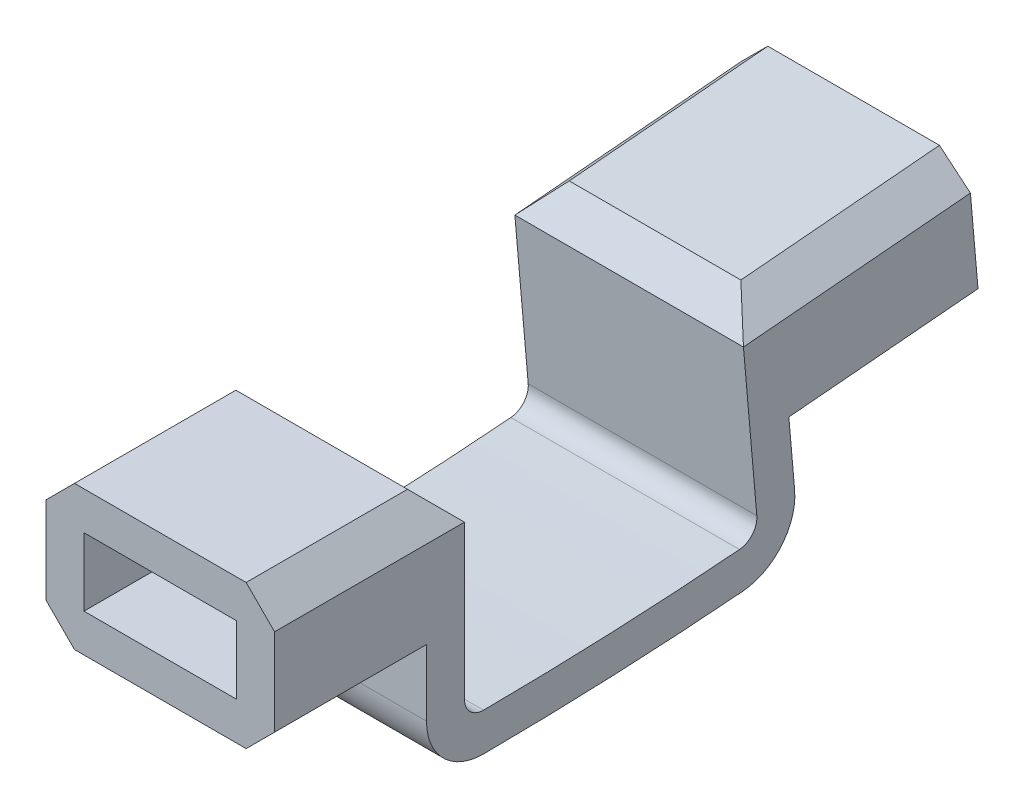
ISO-10303-21;
HEADER;
FILE_DESCRIPTION(('STEP AP214'),'2;1');
FILE_NAME('part.step','',(''),(''),'','','');
FILE_SCHEMA(('AUTOMOTIVE_DESIGN { 1 0 10303 214 1 1 1 1 }'));
ENDSEC;
DATA;
#1=APPLICATION_CONTEXT('core data for automotive mechanical design processes');
#2=APPLICATION_PROTOCOL_DEFINITION('international standard','automotive_design',2000,#1);
#3=PRODUCT_CONTEXT('',#1,'mechanical');
#4=PRODUCT('Part','Part','',(#3));
#5=PRODUCT_RELATED_PRODUCT_CATEGORY('part','',(#4));
#6=PRODUCT_DEFINITION_FORMATION('','',#4);
#7=PRODUCT_DEFINITION_CONTEXT('part definition',#1,'design');
#8=PRODUCT_DEFINITION('design','',#6,#7);
#9=PRODUCT_DEFINITION_SHAPE('','',#8);
#10=(LENGTH_UNIT() NAMED_UNIT(*) SI_UNIT(.MILLI.,.METRE.));
#11=(NAMED_UNIT(*) PLANE_ANGLE_UNIT() SI_UNIT($,.RADIAN.));
#12=(NAMED_UNIT(*) SI_UNIT($,.STERADIAN.) SOLID_ANGLE_UNIT());
#13=UNCERTAINTY_MEASURE_WITH_UNIT(LENGTH_MEASURE(1.E-05),#10,'distance_accuracy_value','');
#14=(GEOMETRIC_REPRESENTATION_CONTEXT(3) GLOBAL_UNCERTAINTY_ASSIGNED_CONTEXT((#13)) GLOBAL_UNIT_ASSIGNED_CONTEXT((#10,
#11,#12)) REPRESENTATION_CONTEXT('',''));
#15=CARTESIAN_POINT('',(0.,0.,0.));
#16=DIRECTION('',(0.,0.,1.));
#17=DIRECTION('',(1.,0.,0.));
#18=AXIS2_PLACEMENT_3D('',#15,#16,#17);
#19=CARTESIAN_POINT('',(0.,0.,8.));
#20=DIRECTION('',(0.,0.,1.));
#21=DIRECTION('',(1.,0.,0.));
#22=AXIS2_PLACEMENT_3D('',#19,#20,#21);
#23=PLANE('',#22);
#24=DIRECTION('',(0.,-1.,0.));
#25=VECTOR('',#24,1.);
#26=CARTESIAN_POINT('',(-6.02,3.79,8.));
#27=LINE('',#26,#25);
#28=CARTESIAN_POINT('',(-6.02,2.29,8.));
#29=VERTEX_POINT('',#28);
#30=CARTESIAN_POINT('',(-6.02,-2.28999999999999,8.));
#31=VERTEX_POINT('',#30);
#32=EDGE_CURVE('E424',#29,#31,#27,.T.);
#33=ORIENTED_EDGE('',*,*,#32,.T.);
#34=DIRECTION('',(-0.707106781186546,0.707106781186549,0.));
#35=VECTOR('',#34,1.);
#36=CARTESIAN_POINT('',(-4.15500000000001,-4.15499999999999,8.));
#37=LINE('',#36,#35);
#38=CARTESIAN_POINT('',(-4.52,-3.79,8.));
#39=VERTEX_POINT('',#38);
#40=EDGE_CURVE('E481',#31,#39,#37,.F.);
#41=ORIENTED_EDGE('',*,*,#40,.T.);
#42=DIRECTION('',(1.,0.,0.));
#43=VECTOR('',#42,1.);
#44=CARTESIAN_POINT('',(-6.02,-3.79,8.));
#45=LINE('',#44,#43);
#46=CARTESIAN_POINT('',(4.52,-3.79,8.));
#47=VERTEX_POINT('',#46);
#48=EDGE_CURVE('E427',#39,#47,#45,.T.);
#49=ORIENTED_EDGE('',*,*,#48,.T.);
#50=DIRECTION('',(-0.707106781186548,-0.707106781186548,0.));
#51=VECTOR('',#50,1.);
#52=CARTESIAN_POINT('',(4.155,-4.155,8.));
#53=LINE('',#52,#51);
#54=CARTESIAN_POINT('',(6.02,-2.29,8.));
#55=VERTEX_POINT('',#54);
#56=EDGE_CURVE('E479',#47,#55,#53,.F.);
#57=ORIENTED_EDGE('',*,*,#56,.T.);
#58=DIRECTION('',(0.,1.,0.));
#59=VECTOR('',#58,1.);
#60=CARTESIAN_POINT('',(6.02,3.79,8.));
#61=LINE('',#60,#59);
#62=CARTESIAN_POINT('',(6.02,2.29,8.));
#63=VERTEX_POINT('',#62);
#64=EDGE_CURVE('E418',#55,#63,#61,.T.);
#65=ORIENTED_EDGE('',*,*,#64,.T.);
#66=DIRECTION('',(0.707106781186549,-0.707106781186546,0.));
#67=VECTOR('',#66,1.);
#68=CARTESIAN_POINT('',(4.15499999999999,4.155,8.));
#69=LINE('',#68,#67);
#70=CARTESIAN_POINT('',(4.51999999999999,3.79,8.));
#71=VERTEX_POINT('',#70);
#72=EDGE_CURVE('E477',#63,#71,#69,.F.);
#73=ORIENTED_EDGE('',*,*,#72,.T.);
#74=DIRECTION('',(-1.,0.,0.));
#75=VECTOR('',#74,1.);
#76=CARTESIAN_POINT('',(-6.02,3.79,8.));
#77=LINE('',#76,#75);
#78=CARTESIAN_POINT('',(-4.51999999999999,3.79,8.));
#79=VERTEX_POINT('',#78);
#80=EDGE_CURVE('E421',#71,#79,#77,.T.);
#81=ORIENTED_EDGE('',*,*,#80,.T.);
#82=DIRECTION('',(0.707106781186549,0.707106781186546,0.));
#83=VECTOR('',#82,1.);
#84=CARTESIAN_POINT('',(-4.15499999999998,4.155,8.));
#85=LINE('',#84,#83);
#86=EDGE_CURVE('E475',#79,#29,#85,.F.);
#87=ORIENTED_EDGE('',*,*,#86,.T.);
#88=EDGE_LOOP('',(#33,#41,#49,#57,#65,#73,#81,#87));
#89=FACE_BOUND('',#88,.T.);
#90=DIRECTION('',(1.,0.,0.));
#91=VECTOR('',#90,1.);
#92=CARTESIAN_POINT('',(4.02,-1.79,8.));
#93=LINE('',#92,#91);
#94=CARTESIAN_POINT('',(-4.02,-1.79,8.));
#95=VERTEX_POINT('',#94);
#96=CARTESIAN_POINT('',(4.02,-1.79,8.));
#97=VERTEX_POINT('',#96);
#98=EDGE_CURVE('E391',#95,#97,#93,.T.);
#99=ORIENTED_EDGE('',*,*,#98,.F.);
#100=DIRECTION('',(0.,-1.,0.));
#101=VECTOR('',#100,1.);
#102=CARTESIAN_POINT('',(-4.02,-1.79,8.));
#103=LINE('',#102,#101);
#104=CARTESIAN_POINT('',(-4.02,1.79,8.));
#105=VERTEX_POINT('',#104);
#106=EDGE_CURVE('E389',#105,#95,#103,.T.);
#107=ORIENTED_EDGE('',*,*,#106,.F.);
#108=DIRECTION('',(-1.,0.,0.));
#109=VECTOR('',#108,1.);
#110=CARTESIAN_POINT('',(4.02,1.79,8.));
#111=LINE('',#110,#109);
#112=CARTESIAN_POINT('',(4.02,1.79,8.));
#113=VERTEX_POINT('',#112);
#114=EDGE_CURVE('E397',#113,#105,#111,.T.);
#115=ORIENTED_EDGE('',*,*,#114,.F.);
#116=DIRECTION('',(0.,1.,0.));
#117=VECTOR('',#116,1.);
#118=CARTESIAN_POINT('',(4.02,-1.79,8.));
#119=LINE('',#118,#117);
#120=EDGE_CURVE('E394',#97,#113,#119,.T.);
#121=ORIENTED_EDGE('',*,*,#120,.F.);
#122=EDGE_LOOP('',(#99,#107,#115,#121));
#123=FACE_BOUND('',#122,.T.);
#124=ADVANCED_FACE('F45',(#89,#123),#23,.T.);
#125=CARTESIAN_POINT('',(6.02,3.79,8.));
#126=DIRECTION('',(-1.,0.,0.));
#127=DIRECTION('',(0.,0.,1.));
#128=AXIS2_PLACEMENT_3D('',#125,#126,#127);
#129=PLANE('',#128);
#130=DIRECTION('',(0.,0.996194698091746,0.0871557427476521));
#131=VECTOR('',#130,1.);
#132=CARTESIAN_POINT('',(6.02,-4.94057397638758,-19.390234428028));
#133=LINE('',#132,#131);
#134=CARTESIAN_POINT('',(6.02,-4.94057397638758,-19.390234428028));
#135=VERTEX_POINT('',#134);
#136=CARTESIAN_POINT('',(6.02,-1.45671186892928,-19.0854359883379));
#137=VERTEX_POINT('',#136);
#138=EDGE_CURVE('E315',#135,#137,#133,.T.);
#139=ORIENTED_EDGE('',*,*,#138,.T.);
#140=DIRECTION('',(0.,0.0871557427476518,-0.996194698091746));
#141=VECTOR('',#140,1.);
#142=CARTESIAN_POINT('',(6.02,-0.585154441452762,-29.0473829692553));
#143=LINE('',#142,#141);
#144=CARTESIAN_POINT('',(6.02,-0.585154441452762,-29.0473829692553));
#145=VERTEX_POINT('',#144);
#146=EDGE_CURVE('E442',#137,#145,#143,.T.);
#147=ORIENTED_EDGE('',*,*,#146,.T.);
#148=DIRECTION('',(0.,0.996194698091746,0.0871557427476517));
#149=VECTOR('',#148,1.);
#150=CARTESIAN_POINT('',(6.02,5.47170932294505,-28.5174760533496));
#151=LINE('',#150,#149);
#152=CARTESIAN_POINT('',(6.02,3.97741727580741,-28.6482096674711));
#153=VERTEX_POINT('',#152);
#154=EDGE_CURVE('E303',#145,#153,#151,.T.);
#155=ORIENTED_EDGE('',*,*,#154,.T.);
#156=DIRECTION('',(0.,-0.0871557427476518,0.996194698091746));
#157=VECTOR('',#156,1.);
#158=CARTESIAN_POINT('',(6.02,2.93154836283559,-16.6938732903701));
#159=LINE('',#158,#157);
#160=CARTESIAN_POINT('',(6.02,2.93154836283559,-16.6938732903701));
#161=VERTEX_POINT('',#160);
#162=EDGE_CURVE('E440',#153,#161,#159,.T.);
#163=ORIENTED_EDGE('',*,*,#162,.T.);
#164=DIRECTION('',(0.,0.996194698091746,0.087155742747652));
#165=VECTOR('',#164,1.);
#166=CARTESIAN_POINT('',(6.02,-5.11488546188288,-17.3978450318445));
#167=LINE('',#166,#165);
#168=CARTESIAN_POINT('',(6.02,-5.11488546188288,-17.3978450318445));
#169=VERTEX_POINT('',#168);
#170=EDGE_CURVE('E342',#169,#161,#167,.T.);
#171=ORIENTED_EDGE('',*,*,#170,.F.);
#172=CARTESIAN_POINT('',(6.02,-5.20204120463053,-16.4016503337527));
#173=DIRECTION('',(1.,0.,0.));
#174=DIRECTION('',(0.,0.,-1.));
#175=AXIS2_PLACEMENT_3D('',#172,#173,#174);
#176=CIRCLE('',#175,1.);
#177=CARTESIAN_POINT('',(6.02,-6.19871326071766,-16.4831660538013));
#178=VERTEX_POINT('',#177);
#179=EDGE_CURVE('E345',#178,#169,#176,.T.);
#180=ORIENTED_EDGE('',*,*,#179,.F.);
#181=CARTESIAN_POINT('',(6.02,170.883288601951,-2.));
#182=DIRECTION('',(1.,0.,0.));
#183=DIRECTION('',(0.,0.,-1.));
#184=AXIS2_PLACEMENT_3D('',#181,#182,#183);
#185=CIRCLE('',#184,177.673288601951);
#186=CARTESIAN_POINT('',(6.02,-6.78715387586887,-3.00566016520049));
#187=VERTEX_POINT('',#186);
#188=EDGE_CURVE('E348',#187,#178,#185,.T.);
#189=ORIENTED_EDGE('',*,*,#188,.F.);
#190=CARTESIAN_POINT('',(6.02,-5.78716989473221,-3.));
#191=DIRECTION('',(1.,0.,0.));
#192=DIRECTION('',(0.,0.,-1.));
#193=AXIS2_PLACEMENT_3D('',#190,#191,#192);
#194=CIRCLE('',#193,1.00000000000001);
#195=CARTESIAN_POINT('',(6.02,-5.78716989473221,-2.));
#196=VERTEX_POINT('',#195);
#197=EDGE_CURVE('E351',#196,#187,#194,.T.);
#198=ORIENTED_EDGE('',*,*,#197,.F.);
#199=DIRECTION('',(0.,-1.,0.));
#200=VECTOR('',#199,1.);
#201=CARTESIAN_POINT('',(6.02,0.,-2.));
#202=LINE('',#201,#200);
#203=CARTESIAN_POINT('',(6.02,2.29,-2.));
#204=VERTEX_POINT('',#203);
#205=EDGE_CURVE('E340',#204,#196,#202,.T.);
#206=ORIENTED_EDGE('',*,*,#205,.F.);
#207=DIRECTION('',(0.,0.,1.));
#208=VECTOR('',#207,1.);
#209=CARTESIAN_POINT('',(6.02,2.29,8.));
#210=LINE('',#209,#208);
#211=EDGE_CURVE('E435',#204,#63,#210,.T.);
#212=ORIENTED_EDGE('',*,*,#211,.T.);
#213=ORIENTED_EDGE('',*,*,#64,.F.);
#214=DIRECTION('',(0.,0.,-1.));
#215=VECTOR('',#214,1.);
#216=CARTESIAN_POINT('',(6.02,-2.29,8.));
#217=LINE('',#216,#215);
#218=CARTESIAN_POINT('',(6.02,-2.29,0.));
#219=VERTEX_POINT('',#218);
#220=EDGE_CURVE('E437',#55,#219,#217,.T.);
#221=ORIENTED_EDGE('',*,*,#220,.T.);
#222=DIRECTION('',(0.,-1.,0.));
#223=VECTOR('',#222,1.);
#224=CARTESIAN_POINT('',(6.02,-3.79,0.));
#225=LINE('',#224,#223);
#226=CARTESIAN_POINT('',(6.02,-5.78716989473221,0.));
#227=VERTEX_POINT('',#226);
#228=EDGE_CURVE('E354',#219,#227,#225,.T.);
#229=ORIENTED_EDGE('',*,*,#228,.T.);
#230=CARTESIAN_POINT('',(6.02,-5.78716989473221,-3.));
#231=DIRECTION('',(1.,0.,0.));
#232=DIRECTION('',(0.,-1.,0.));
#233=AXIS2_PLACEMENT_3D('',#230,#231,#232);
#234=CIRCLE('',#233,3.00000000000001);
#235=CARTESIAN_POINT('',(6.02,-8.78712183814216,-3.01698049560145));
#236=VERTEX_POINT('',#235);
#237=EDGE_CURVE('E357',#227,#236,#234,.T.);
#238=ORIENTED_EDGE('',*,*,#237,.T.);
#239=CARTESIAN_POINT('',(6.02,170.883288601951,-2.));
#240=DIRECTION('',(1.,0.,0.));
#241=DIRECTION('',(0.,-1.,0.));
#242=AXIS2_PLACEMENT_3D('',#239,#240,#241);
#243=CIRCLE('',#242,179.673288601951);
#244=CARTESIAN_POINT('',(6.02,-8.19205737289195,-16.6461974938985));
#245=VERTEX_POINT('',#244);
#246=EDGE_CURVE('E360',#236,#245,#243,.T.);
#247=ORIENTED_EDGE('',*,*,#246,.T.);
#248=CARTESIAN_POINT('',(6.02,-5.20204120463053,-16.4016503337527));
#249=DIRECTION('',(1.,0.,0.));
#250=DIRECTION('',(0.,-1.,0.));
#251=AXIS2_PLACEMENT_3D('',#248,#249,#250);
#252=CIRCLE('',#251,3.);
#253=EDGE_CURVE('E363',#245,#135,#252,.T.);
#254=ORIENTED_EDGE('',*,*,#253,.T.);
#255=EDGE_LOOP('',(#139,#147,#155,#163,#171,#180,#189,#198,#206,#212,#213,#221,#229,#238,#247,#254));
#256=FACE_BOUND('',#255,.T.);
#257=ADVANCED_FACE('F519',(#256),#129,.F.);
#258=CARTESIAN_POINT('',(-6.02,3.79,8.));
#259=DIRECTION('',(0.,-1.,0.));
#260=DIRECTION('',(0.,0.,-1.));
#261=AXIS2_PLACEMENT_3D('',#258,#259,#260);
#262=PLANE('',#261);
#263=ORIENTED_EDGE('',*,*,#80,.F.);
#264=DIRECTION('',(0.,0.,-1.));
#265=VECTOR('',#264,1.);
#266=CARTESIAN_POINT('',(4.51999999999999,3.79,8.));
#267=LINE('',#266,#265);
#268=CARTESIAN_POINT('',(4.51999999999999,3.79,-0.499999999999992));
#269=VERTEX_POINT('',#268);
#270=EDGE_CURVE('E486',#71,#269,#267,.T.);
#271=ORIENTED_EDGE('',*,*,#270,.T.);
#272=DIRECTION('',(-1.,0.,0.));
#273=VECTOR('',#272,1.);
#274=CARTESIAN_POINT('',(-6.02,3.79,-0.499999999999992));
#275=LINE('',#274,#273);
#276=CARTESIAN_POINT('',(-4.51999999999999,3.79,-0.499999999999992));
#277=VERTEX_POINT('',#276);
#278=EDGE_CURVE('E70',#269,#277,#275,.T.);
#279=ORIENTED_EDGE('',*,*,#278,.T.);
#280=DIRECTION('',(0.,0.,1.));
#281=VECTOR('',#280,1.);
#282=CARTESIAN_POINT('',(-4.51999999999999,3.79,8.));
#283=LINE('',#282,#281);
#284=EDGE_CURVE('E483',#277,#79,#283,.T.);
#285=ORIENTED_EDGE('',*,*,#284,.T.);
#286=EDGE_LOOP('',(#263,#271,#279,#285));
#287=FACE_BOUND('',#286,.T.);
#288=ADVANCED_FACE('F510',(#287),#262,.F.);
#289=CARTESIAN_POINT('',(-6.02,3.79,8.));
#290=DIRECTION('',(1.,0.,0.));
#291=DIRECTION('',(0.,0.,-1.));
#292=AXIS2_PLACEMENT_3D('',#289,#290,#291);
#293=PLANE('',#292);
#294=DIRECTION('',(0.,-0.996194698091746,-0.0871557427476517));
#295=VECTOR('',#294,1.);
#296=CARTESIAN_POINT('',(-6.02,5.47170932294505,-28.5174760533496));
#297=LINE('',#296,#295);
#298=CARTESIAN_POINT('',(-6.02,3.97741727580741,-28.6482096674711));
#299=VERTEX_POINT('',#298);
#300=CARTESIAN_POINT('',(-6.02,-0.585154441452759,-29.0473829692553));
#301=VERTEX_POINT('',#300);
#302=EDGE_CURVE('E309',#299,#301,#297,.T.);
#303=ORIENTED_EDGE('',*,*,#302,.T.);
#304=DIRECTION('',(0.,-0.0871557427476518,0.996194698091746));
#305=VECTOR('',#304,1.);
#306=CARTESIAN_POINT('',(-6.02,-1.45671186892928,-19.0854359883379));
#307=LINE('',#306,#305);
#308=CARTESIAN_POINT('',(-6.02,-1.45671186892928,-19.0854359883379));
#309=VERTEX_POINT('',#308);
#310=EDGE_CURVE('E459',#301,#309,#307,.T.);
#311=ORIENTED_EDGE('',*,*,#310,.T.);
#312=DIRECTION('',(0.,-0.996194698091746,-0.087155742747652));
#313=VECTOR('',#312,1.);
#314=CARTESIAN_POINT('',(-6.02,-4.94057397638758,-19.390234428028));
#315=LINE('',#314,#313);
#316=CARTESIAN_POINT('',(-6.02,-4.94057397638758,-19.390234428028));
#317=VERTEX_POINT('',#316);
#318=EDGE_CURVE('E338',#309,#317,#315,.T.);
#319=ORIENTED_EDGE('',*,*,#318,.T.);
#320=CARTESIAN_POINT('',(-6.02,-5.20204120463053,-16.4016503337527));
#321=DIRECTION('',(1.,0.,0.));
#322=DIRECTION('',(0.,0.,-1.));
#323=AXIS2_PLACEMENT_3D('',#320,#321,#322);
#324=CIRCLE('',#323,3.);
#325=CARTESIAN_POINT('',(-6.02,-8.19205737289194,-16.6461974938985));
#326=VERTEX_POINT('',#325);
#327=EDGE_CURVE('E336',#317,#326,#324,.F.);
#328=ORIENTED_EDGE('',*,*,#327,.T.);
#329=CARTESIAN_POINT('',(-6.02,170.883288601951,-2.));
#330=DIRECTION('',(1.,0.,0.));
#331=DIRECTION('',(0.,0.,-1.));
#332=AXIS2_PLACEMENT_3D('',#329,#330,#331);
#333=CIRCLE('',#332,179.673288601951);
#334=CARTESIAN_POINT('',(-6.02,-8.78712183814217,-3.01698049560145));
#335=VERTEX_POINT('',#334);
#336=EDGE_CURVE('E334',#326,#335,#333,.F.);
#337=ORIENTED_EDGE('',*,*,#336,.T.);
#338=CARTESIAN_POINT('',(-6.02,-5.78716989473221,-3.));
#339=DIRECTION('',(1.,0.,0.));
#340=DIRECTION('',(0.,0.,-1.));
#341=AXIS2_PLACEMENT_3D('',#338,#339,#340);
#342=CIRCLE('',#341,3.00000000000001);
#343=CARTESIAN_POINT('',(-6.02,-5.78716989473221,0.));
#344=VERTEX_POINT('',#343);
#345=EDGE_CURVE('E332',#335,#344,#342,.F.);
#346=ORIENTED_EDGE('',*,*,#345,.T.);
#347=DIRECTION('',(0.,1.,0.));
#348=VECTOR('',#347,1.);
#349=CARTESIAN_POINT('',(-6.02,-3.79,0.));
#350=LINE('',#349,#348);
#351=CARTESIAN_POINT('',(-6.02,-2.28999999999999,0.));
#352=VERTEX_POINT('',#351);
#353=EDGE_CURVE('E330',#344,#352,#350,.T.);
#354=ORIENTED_EDGE('',*,*,#353,.T.);
#355=DIRECTION('',(0.,0.,1.));
#356=VECTOR('',#355,1.);
#357=CARTESIAN_POINT('',(-6.02,-2.28999999999999,8.));
#358=LINE('',#357,#356);
#359=EDGE_CURVE('E454',#352,#31,#358,.T.);
#360=ORIENTED_EDGE('',*,*,#359,.T.);
#361=ORIENTED_EDGE('',*,*,#32,.F.);
#362=DIRECTION('',(0.,0.,-1.));
#363=VECTOR('',#362,1.);
#364=CARTESIAN_POINT('',(-6.02,2.29,8.));
#365=LINE('',#364,#363);
#366=CARTESIAN_POINT('',(-6.02,2.29,-2.));
#367=VERTEX_POINT('',#366);
#368=EDGE_CURVE('E452',#29,#367,#365,.T.);
#369=ORIENTED_EDGE('',*,*,#368,.T.);
#370=DIRECTION('',(0.,-1.,0.));
#371=VECTOR('',#370,1.);
#372=CARTESIAN_POINT('',(-6.02,0.,-2.));
#373=LINE('',#372,#371);
#374=CARTESIAN_POINT('',(-6.02,-5.78716989473221,-1.99999999999999));
#375=VERTEX_POINT('',#374);
#376=EDGE_CURVE('E386',#367,#375,#373,.T.);
#377=ORIENTED_EDGE('',*,*,#376,.T.);
#378=CARTESIAN_POINT('',(-6.02,-5.78716989473221,-3.));
#379=DIRECTION('',(1.,0.,0.));
#380=DIRECTION('',(0.,0.,-1.));
#381=AXIS2_PLACEMENT_3D('',#378,#379,#380);
#382=CIRCLE('',#381,1.00000000000001);
#383=CARTESIAN_POINT('',(-6.02,-6.78715387586887,-3.00566016520049));
#384=VERTEX_POINT('',#383);
#385=EDGE_CURVE('E327',#384,#375,#382,.F.);
#386=ORIENTED_EDGE('',*,*,#385,.F.);
#387=CARTESIAN_POINT('',(-6.02,170.883288601951,-2.));
#388=DIRECTION('',(1.,0.,0.));
#389=DIRECTION('',(0.,0.,-1.));
#390=AXIS2_PLACEMENT_3D('',#387,#388,#389);
#391=CIRCLE('',#390,177.673288601951);
#392=CARTESIAN_POINT('',(-6.02,-6.19871326071767,-16.4831660538013));
#393=VERTEX_POINT('',#392);
#394=EDGE_CURVE('E324',#393,#384,#391,.F.);
#395=ORIENTED_EDGE('',*,*,#394,.F.);
#396=CARTESIAN_POINT('',(-6.02,-5.20204120463053,-16.4016503337527));
#397=DIRECTION('',(1.,0.,0.));
#398=DIRECTION('',(0.,0.,-1.));
#399=AXIS2_PLACEMENT_3D('',#396,#397,#398);
#400=CIRCLE('',#399,1.);
#401=CARTESIAN_POINT('',(-6.02,-5.11488546188288,-17.3978450318445));
#402=VERTEX_POINT('',#401);
#403=EDGE_CURVE('E320',#402,#393,#400,.F.);
#404=ORIENTED_EDGE('',*,*,#403,.F.);
#405=DIRECTION('',(0.,-0.996194698091746,-0.087155742747652));
#406=VECTOR('',#405,1.);
#407=CARTESIAN_POINT('',(-6.02,-5.11488546188288,-17.3978450318445));
#408=LINE('',#407,#406);
#409=CARTESIAN_POINT('',(-6.02,2.93154836283559,-16.6938732903701));
#410=VERTEX_POINT('',#409);
#411=EDGE_CURVE('E318',#410,#402,#408,.T.);
#412=ORIENTED_EDGE('',*,*,#411,.F.);
#413=DIRECTION('',(0.,0.0871557427476518,-0.996194698091746));
#414=VECTOR('',#413,1.);
#415=CARTESIAN_POINT('',(-6.02,3.97741727580741,-28.6482096674711));
#416=LINE('',#415,#414);
#417=EDGE_CURVE('E456',#410,#299,#416,.T.);
#418=ORIENTED_EDGE('',*,*,#417,.T.);
#419=EDGE_LOOP('',(#303,#311,#319,#328,#337,#346,#354,#360,#361,#369,#377,#386,#395,#404,#412,#418));
#420=FACE_BOUND('',#419,.T.);
#421=ADVANCED_FACE('F531',(#420),#293,.F.);
#422=CARTESIAN_POINT('',(-6.02,-3.79,8.));
#423=DIRECTION('',(0.,1.,0.));
#424=DIRECTION('',(0.,0.,1.));
#425=AXIS2_PLACEMENT_3D('',#422,#423,#424);
#426=PLANE('',#425);
#427=ORIENTED_EDGE('',*,*,#48,.F.);
#428=DIRECTION('',(0.,0.,-1.));
#429=VECTOR('',#428,1.);
#430=CARTESIAN_POINT('',(-4.52,-3.79,8.));
#431=LINE('',#430,#429);
#432=CARTESIAN_POINT('',(-4.52,-3.79,0.));
#433=VERTEX_POINT('',#432);
#434=EDGE_CURVE('E472',#39,#433,#431,.T.);
#435=ORIENTED_EDGE('',*,*,#434,.T.);
#436=DIRECTION('',(1.,0.,0.));
#437=VECTOR('',#436,1.);
#438=CARTESIAN_POINT('',(-26.28042618021,-3.79,0.));
#439=LINE('',#438,#437);
#440=CARTESIAN_POINT('',(4.52,-3.79,0.));
#441=VERTEX_POINT('',#440);
#442=EDGE_CURVE('E374',#433,#441,#439,.T.);
#443=ORIENTED_EDGE('',*,*,#442,.T.);
#444=DIRECTION('',(0.,0.,1.));
#445=VECTOR('',#444,1.);
#446=CARTESIAN_POINT('',(4.52,-3.79,8.));
#447=LINE('',#446,#445);
#448=EDGE_CURVE('E470',#441,#47,#447,.T.);
#449=ORIENTED_EDGE('',*,*,#448,.T.);
#450=EDGE_LOOP('',(#427,#435,#443,#449));
#451=FACE_BOUND('',#450,.T.);
#452=ADVANCED_FACE('F542',(#451),#426,.F.);
#453=CARTESIAN_POINT('',(-4.02,-1.79,8.));
#454=DIRECTION('',(1.,0.,0.));
#455=DIRECTION('',(0.,0.,-1.));
#456=AXIS2_PLACEMENT_3D('',#453,#454,#455);
#457=PLANE('',#456);
#458=DIRECTION('',(0.,-1.,0.));
#459=VECTOR('',#458,1.);
#460=CARTESIAN_POINT('',(-4.02,-1.79,0.));
#461=LINE('',#460,#459);
#462=CARTESIAN_POINT('',(-4.02,1.79,0.));
#463=VERTEX_POINT('',#462);
#464=CARTESIAN_POINT('',(-4.02,-1.79,0.));
#465=VERTEX_POINT('',#464);
#466=EDGE_CURVE('E388',#463,#465,#461,.T.);
#467=ORIENTED_EDGE('',*,*,#466,.F.);
#468=DIRECTION('',(0.,0.,-1.));
#469=VECTOR('',#468,1.);
#470=CARTESIAN_POINT('',(-4.02,1.79,8.));
#471=LINE('',#470,#469);
#472=EDGE_CURVE('E399',#105,#463,#471,.T.);
#473=ORIENTED_EDGE('',*,*,#472,.F.);
#474=ORIENTED_EDGE('',*,*,#106,.T.);
#475=DIRECTION('',(0.,0.,-1.));
#476=VECTOR('',#475,1.);
#477=CARTESIAN_POINT('',(-4.02,-1.79,8.));
#478=LINE('',#477,#476);
#479=EDGE_CURVE('E415',#95,#465,#478,.T.);
#480=ORIENTED_EDGE('',*,*,#479,.T.);
#481=EDGE_LOOP('',(#467,#473,#474,#480));
#482=FACE_BOUND('',#481,.T.);
#483=ADVANCED_FACE('F632',(#482),#457,.T.);
#484=CARTESIAN_POINT('',(4.02,-1.79,8.));
#485=DIRECTION('',(0.,1.,0.));
#486=DIRECTION('',(0.,0.,1.));
#487=AXIS2_PLACEMENT_3D('',#484,#485,#486);
#488=PLANE('',#487);
#489=DIRECTION('',(1.,0.,0.));
#490=VECTOR('',#489,1.);
#491=CARTESIAN_POINT('',(4.02,-1.79,0.));
#492=LINE('',#491,#490);
#493=CARTESIAN_POINT('',(4.02,-1.79,0.));
#494=VERTEX_POINT('',#493);
#495=EDGE_CURVE('E402',#465,#494,#492,.T.);
#496=ORIENTED_EDGE('',*,*,#495,.F.);
#497=ORIENTED_EDGE('',*,*,#479,.F.);
#498=ORIENTED_EDGE('',*,*,#98,.T.);
#499=DIRECTION('',(0.,0.,-1.));
#500=VECTOR('',#499,1.);
#501=CARTESIAN_POINT('',(4.02,-1.79,8.));
#502=LINE('',#501,#500);
#503=EDGE_CURVE('E413',#97,#494,#502,.T.);
#504=ORIENTED_EDGE('',*,*,#503,.T.);
#505=EDGE_LOOP('',(#496,#497,#498,#504));
#506=FACE_BOUND('',#505,.T.);
#507=ADVANCED_FACE('F929',(#506),#488,.T.);
#508=CARTESIAN_POINT('',(4.02,-1.79,8.));
#509=DIRECTION('',(-1.,0.,0.));
#510=DIRECTION('',(0.,0.,1.));
#511=AXIS2_PLACEMENT_3D('',#508,#509,#510);
#512=PLANE('',#511);
#513=DIRECTION('',(0.,1.,0.));
#514=VECTOR('',#513,1.);
#515=CARTESIAN_POINT('',(4.02,-1.79,0.));
#516=LINE('',#515,#514);
#517=CARTESIAN_POINT('',(4.02,1.79,0.));
#518=VERTEX_POINT('',#517);
#519=EDGE_CURVE('E405',#494,#518,#516,.T.);
#520=ORIENTED_EDGE('',*,*,#519,.F.);
#521=ORIENTED_EDGE('',*,*,#503,.F.);
#522=ORIENTED_EDGE('',*,*,#120,.T.);
#523=DIRECTION('',(0.,0.,-1.));
#524=VECTOR('',#523,1.);
#525=CARTESIAN_POINT('',(4.02,1.79,8.));
#526=LINE('',#525,#524);
#527=EDGE_CURVE('E411',#113,#518,#526,.T.);
#528=ORIENTED_EDGE('',*,*,#527,.T.);
#529=EDGE_LOOP('',(#520,#521,#522,#528));
#530=FACE_BOUND('',#529,.T.);
#531=ADVANCED_FACE('F920',(#530),#512,.T.);
#532=CARTESIAN_POINT('',(4.02,1.79,8.));
#533=DIRECTION('',(0.,-1.,0.));
#534=DIRECTION('',(0.,0.,-1.));
#535=AXIS2_PLACEMENT_3D('',#532,#533,#534);
#536=PLANE('',#535);
#537=DIRECTION('',(-1.,0.,0.));
#538=VECTOR('',#537,1.);
#539=CARTESIAN_POINT('',(4.02,1.79,0.));
#540=LINE('',#539,#538);
#541=EDGE_CURVE('E392',#518,#463,#540,.T.);
#542=ORIENTED_EDGE('',*,*,#541,.F.);
#543=ORIENTED_EDGE('',*,*,#527,.F.);
#544=ORIENTED_EDGE('',*,*,#114,.T.);
#545=ORIENTED_EDGE('',*,*,#472,.T.);
#546=EDGE_LOOP('',(#542,#543,#544,#545));
#547=FACE_BOUND('',#546,.T.);
#548=ADVANCED_FACE('F911',(#547),#536,.T.);
#549=CARTESIAN_POINT('',(0.,0.,0.));
#550=DIRECTION('',(0.,0.,1.));
#551=DIRECTION('',(1.,0.,0.));
#552=AXIS2_PLACEMENT_3D('',#549,#550,#551);
#553=PLANE('',#552);
#554=ORIENTED_EDGE('',*,*,#541,.T.);
#555=ORIENTED_EDGE('',*,*,#466,.T.);
#556=ORIENTED_EDGE('',*,*,#495,.T.);
#557=ORIENTED_EDGE('',*,*,#519,.T.);
#558=EDGE_LOOP('',(#554,#555,#556,#557));
#559=FACE_BOUND('',#558,.T.);
#560=ADVANCED_FACE('F776',(#559),#553,.T.);
#561=CARTESIAN_POINT('',(0.,0.,-2.));
#562=DIRECTION('',(0.,0.,1.));
#563=DIRECTION('',(1.,0.,0.));
#564=AXIS2_PLACEMENT_3D('',#561,#562,#563);
#565=PLANE('',#564);
#566=ORIENTED_EDGE('',*,*,#376,.F.);
#567=DIRECTION('',(1.,0.,0.));
#568=VECTOR('',#567,1.);
#569=CARTESIAN_POINT('',(0.,2.29,-2.));
#570=LINE('',#569,#568);
#571=EDGE_CURVE('E488',#367,#204,#570,.T.);
#572=ORIENTED_EDGE('',*,*,#571,.T.);
#573=ORIENTED_EDGE('',*,*,#205,.T.);
#574=DIRECTION('',(1.,0.,0.));
#575=VECTOR('',#574,1.);
#576=CARTESIAN_POINT('',(-26.28042618021,-5.78716989473221,-2.));
#577=LINE('',#576,#575);
#578=EDGE_CURVE('E377',#375,#196,#577,.T.);
#579=ORIENTED_EDGE('',*,*,#578,.F.);
#580=EDGE_LOOP('',(#566,#572,#573,#579));
#581=FACE_BOUND('',#580,.T.);
#582=ADVANCED_FACE('F526',(#581),#565,.F.);
#583=CARTESIAN_POINT('',(-26.28042618021,-5.11488546188288,-17.3978450318445));
#584=DIRECTION('',(0.,0.087155742747652,-0.996194698091746));
#585=DIRECTION('',(0.,0.996194698091746,0.087155742747652));
#586=AXIS2_PLACEMENT_3D('',#583,#584,#585);
#587=PLANE('',#586);
#588=ORIENTED_EDGE('',*,*,#170,.T.);
#589=DIRECTION('',(-1.,0.,0.));
#590=VECTOR('',#589,1.);
#591=CARTESIAN_POINT('',(-6.02,2.93154836283558,-16.6938732903701));
#592=LINE('',#591,#590);
#593=EDGE_CURVE('E468',#161,#410,#592,.T.);
#594=ORIENTED_EDGE('',*,*,#593,.T.);
#595=ORIENTED_EDGE('',*,*,#411,.T.);
#596=DIRECTION('',(1.,0.,0.));
#597=VECTOR('',#596,1.);
#598=CARTESIAN_POINT('',(-26.28042618021,-5.11488546188288,-17.3978450318445));
#599=LINE('',#598,#597);
#600=EDGE_CURVE('E366',#402,#169,#599,.T.);
#601=ORIENTED_EDGE('',*,*,#600,.T.);
#602=EDGE_LOOP('',(#588,#594,#595,#601));
#603=FACE_BOUND('',#602,.T.);
#604=ADVANCED_FACE('F607',(#603),#587,.F.);
#605=CARTESIAN_POINT('',(-26.28042618021,-5.20204120463053,-16.4016503337527));
#606=DIRECTION('',(1.,0.,0.));
#607=DIRECTION('',(0.,0.,-1.));
#608=AXIS2_PLACEMENT_3D('',#605,#606,#607);
#609=CYLINDRICAL_SURFACE('',#608,1.);
#610=ORIENTED_EDGE('',*,*,#600,.F.);
#611=ORIENTED_EDGE('',*,*,#403,.T.);
#612=DIRECTION('',(1.,0.,0.));
#613=VECTOR('',#612,1.);
#614=CARTESIAN_POINT('',(-26.28042618021,-6.19871326071766,-16.4831660538013));
#615=LINE('',#614,#613);
#616=EDGE_CURVE('E382',#393,#178,#615,.T.);
#617=ORIENTED_EDGE('',*,*,#616,.T.);
#618=ORIENTED_EDGE('',*,*,#179,.T.);
#619=EDGE_LOOP('',(#610,#611,#617,#618));
#620=FACE_BOUND('',#619,.T.);
#621=ADVANCED_FACE('F612',(#620),#609,.F.);
#622=CARTESIAN_POINT('',(-26.28042618021,170.883288601951,-2.));
#623=DIRECTION('',(1.,0.,0.));
#624=DIRECTION('',(0.,0.,-1.));
#625=AXIS2_PLACEMENT_3D('',#622,#623,#624);
#626=CYLINDRICAL_SURFACE('',#625,177.673288601951);
#627=ORIENTED_EDGE('',*,*,#616,.F.);
#628=ORIENTED_EDGE('',*,*,#394,.T.);
#629=DIRECTION('',(1.,0.,0.));
#630=VECTOR('',#629,1.);
#631=CARTESIAN_POINT('',(-26.28042618021,-6.78715387586887,-3.00566016520049));
#632=LINE('',#631,#630);
#633=EDGE_CURVE('E380',#384,#187,#632,.T.);
#634=ORIENTED_EDGE('',*,*,#633,.T.);
#635=ORIENTED_EDGE('',*,*,#188,.T.);
#636=EDGE_LOOP('',(#627,#628,#634,#635));
#637=FACE_BOUND('',#636,.T.);
#638=ADVANCED_FACE('F614',(#637),#626,.F.);
#639=CARTESIAN_POINT('',(-26.28042618021,-5.78716989473221,-3.));
#640=DIRECTION('',(1.,0.,0.));
#641=DIRECTION('',(0.,0.,-1.));
#642=AXIS2_PLACEMENT_3D('',#639,#640,#641);
#643=CYLINDRICAL_SURFACE('',#642,1.00000000000001);
#644=ORIENTED_EDGE('',*,*,#633,.F.);
#645=ORIENTED_EDGE('',*,*,#385,.T.);
#646=ORIENTED_EDGE('',*,*,#578,.T.);
#647=ORIENTED_EDGE('',*,*,#197,.T.);
#648=EDGE_LOOP('',(#644,#645,#646,#647));
#649=FACE_BOUND('',#648,.T.);
#650=ADVANCED_FACE('F529',(#649),#643,.F.);
#651=CARTESIAN_POINT('',(-26.28042618021,-3.79,0.));
#652=DIRECTION('',(0.,0.,1.));
#653=DIRECTION('',(1.,0.,0.));
#654=AXIS2_PLACEMENT_3D('',#651,#652,#653);
#655=PLANE('',#654);
#656=ORIENTED_EDGE('',*,*,#353,.F.);
#657=DIRECTION('',(1.,0.,0.));
#658=VECTOR('',#657,1.);
#659=CARTESIAN_POINT('',(-26.28042618021,-5.78716989473221,0.));
#660=LINE('',#659,#658);
#661=EDGE_CURVE('E372',#344,#227,#660,.T.);
#662=ORIENTED_EDGE('',*,*,#661,.T.);
#663=ORIENTED_EDGE('',*,*,#228,.F.);
#664=DIRECTION('',(0.707106781186548,0.707106781186548,0.));
#665=VECTOR('',#664,1.);
#666=CARTESIAN_POINT('',(6.02,-2.29,0.));
#667=LINE('',#666,#665);
#668=EDGE_CURVE('E11',#219,#441,#667,.F.);
#669=ORIENTED_EDGE('',*,*,#668,.T.);
#670=ORIENTED_EDGE('',*,*,#442,.F.);
#671=DIRECTION('',(0.707106781186546,-0.707106781186549,0.));
#672=VECTOR('',#671,1.);
#673=CARTESIAN_POINT('',(-4.52,-3.79,0.));
#674=LINE('',#673,#672);
#675=EDGE_CURVE('E55',#433,#352,#674,.F.);
#676=ORIENTED_EDGE('',*,*,#675,.T.);
#677=EDGE_LOOP('',(#656,#662,#663,#669,#670,#676));
#678=FACE_BOUND('',#677,.T.);
#679=ADVANCED_FACE('F546',(#678),#655,.T.);
#680=CARTESIAN_POINT('',(-26.28042618021,-5.78716989473221,-3.));
#681=DIRECTION('',(1.,0.,0.));
#682=DIRECTION('',(0.,0.,-1.));
#683=AXIS2_PLACEMENT_3D('',#680,#681,#682);
#684=CYLINDRICAL_SURFACE('',#683,3.00000000000001);
#685=ORIENTED_EDGE('',*,*,#345,.F.);
#686=DIRECTION('',(1.,0.,0.));
#687=VECTOR('',#686,1.);
#688=CARTESIAN_POINT('',(-26.28042618021,-8.78712183814216,-3.01698049560145));
#689=LINE('',#688,#687);
#690=EDGE_CURVE('E370',#335,#236,#689,.T.);
#691=ORIENTED_EDGE('',*,*,#690,.T.);
#692=ORIENTED_EDGE('',*,*,#237,.F.);
#693=ORIENTED_EDGE('',*,*,#661,.F.);
#694=EDGE_LOOP('',(#685,#691,#692,#693));
#695=FACE_BOUND('',#694,.T.);
#696=ADVANCED_FACE('F557',(#695),#684,.T.);
#697=CARTESIAN_POINT('',(-26.28042618021,170.883288601951,-2.));
#698=DIRECTION('',(1.,0.,0.));
#699=DIRECTION('',(0.,0.,-1.));
#700=AXIS2_PLACEMENT_3D('',#697,#698,#699);
#701=CYLINDRICAL_SURFACE('',#700,179.673288601951);
#702=ORIENTED_EDGE('',*,*,#336,.F.);
#703=DIRECTION('',(1.,0.,0.));
#704=VECTOR('',#703,1.);
#705=CARTESIAN_POINT('',(-26.28042618021,-8.19205737289195,-16.6461974938985));
#706=LINE('',#705,#704);
#707=EDGE_CURVE('E368',#326,#245,#706,.T.);
#708=ORIENTED_EDGE('',*,*,#707,.T.);
#709=ORIENTED_EDGE('',*,*,#246,.F.);
#710=ORIENTED_EDGE('',*,*,#690,.F.);
#711=EDGE_LOOP('',(#702,#708,#709,#710));
#712=FACE_BOUND('',#711,.T.);
#713=ADVANCED_FACE('F561',(#712),#701,.T.);
#714=CARTESIAN_POINT('',(-26.28042618021,-5.20204120463053,-16.4016503337527));
#715=DIRECTION('',(1.,0.,0.));
#716=DIRECTION('',(0.,0.,-1.));
#717=AXIS2_PLACEMENT_3D('',#714,#715,#716);
#718=CYLINDRICAL_SURFACE('',#717,3.);
#719=ORIENTED_EDGE('',*,*,#327,.F.);
#720=DIRECTION('',(1.,0.,0.));
#721=VECTOR('',#720,1.);
#722=CARTESIAN_POINT('',(-26.28042618021,-4.94057397638758,-19.390234428028));
#723=LINE('',#722,#721);
#724=EDGE_CURVE('E321',#317,#135,#723,.T.);
#725=ORIENTED_EDGE('',*,*,#724,.T.);
#726=ORIENTED_EDGE('',*,*,#253,.F.);
#727=ORIENTED_EDGE('',*,*,#707,.F.);
#728=EDGE_LOOP('',(#719,#725,#726,#727));
#729=FACE_BOUND('',#728,.T.);
#730=ADVANCED_FACE('F565',(#729),#718,.T.);
#731=CARTESIAN_POINT('',(-26.28042618021,-4.94057397638758,-19.390234428028));
#732=DIRECTION('',(0.,0.087155742747652,-0.996194698091746));
#733=DIRECTION('',(0.,0.996194698091746,0.087155742747652));
#734=AXIS2_PLACEMENT_3D('',#731,#732,#733);
#735=PLANE('',#734);
#736=ORIENTED_EDGE('',*,*,#318,.F.);
#737=DIRECTION('',(0.707106781186548,-0.704416026402759,-0.061628416716215));
#738=VECTOR('',#737,1.);
#739=CARTESIAN_POINT('',(-6.02,-1.45671186892927,-19.0854359883379));
#740=LINE('',#739,#738);
#741=CARTESIAN_POINT('',(-4.52,-2.9510039160669,-19.2161696024593));
#742=VERTEX_POINT('',#741);
#743=EDGE_CURVE('E493',#309,#742,#740,.T.);
#744=ORIENTED_EDGE('',*,*,#743,.T.);
#745=DIRECTION('',(1.,0.,0.));
#746=VECTOR('',#745,1.);
#747=CARTESIAN_POINT('',(-6.02,-2.9510039160669,-19.2161696024593));
#748=LINE('',#747,#746);
#749=CARTESIAN_POINT('',(4.52000000000001,-2.9510039160669,-19.2161696024593));
#750=VERTEX_POINT('',#749);
#751=EDGE_CURVE('E299',#742,#750,#748,.T.);
#752=ORIENTED_EDGE('',*,*,#751,.T.);
#753=DIRECTION('',(0.707106781186546,0.704416026402761,0.0616284167162152));
#754=VECTOR('',#753,1.);
#755=CARTESIAN_POINT('',(4.52000000000001,-2.9510039160669,-19.2161696024593));
#756=LINE('',#755,#754);
#757=EDGE_CURVE('E490',#750,#137,#756,.T.);
#758=ORIENTED_EDGE('',*,*,#757,.T.);
#759=ORIENTED_EDGE('',*,*,#138,.F.);
#760=ORIENTED_EDGE('',*,*,#724,.F.);
#761=EDGE_LOOP('',(#736,#744,#752,#758,#759,#760));
#762=FACE_BOUND('',#761,.T.);
#763=ADVANCED_FACE('F571',(#762),#735,.T.);
#764=CARTESIAN_POINT('',(-6.02,4.42584040997323,-16.5631396762487));
#765=DIRECTION('',(0.,0.996194698091746,0.0871557427476518));
#766=DIRECTION('',(0.,-0.0871557427476518,0.996194698091746));
#767=AXIS2_PLACEMENT_3D('',#764,#765,#766);
#768=PLANE('',#767);
#769=DIRECTION('',(-1.,0.,0.));
#770=VECTOR('',#769,1.);
#771=CARTESIAN_POINT('',(-6.02,5.47170932294505,-28.5174760533496));
#772=LINE('',#771,#770);
#773=CARTESIAN_POINT('',(4.51999999999999,5.47170932294505,-28.5174760533496));
#774=VERTEX_POINT('',#773);
#775=CARTESIAN_POINT('',(-4.51999999999999,5.47170932294505,-28.5174760533496));
#776=VERTEX_POINT('',#775);
#777=EDGE_CURVE('E306',#774,#776,#772,.T.);
#778=ORIENTED_EDGE('',*,*,#777,.T.);
#779=DIRECTION('',(0.,-0.0871557427476518,0.996194698091746));
#780=VECTOR('',#779,1.);
#781=CARTESIAN_POINT('',(-4.51999999999999,4.42584040997323,-16.5631396762487));
#782=LINE('',#781,#780);
#783=CARTESIAN_POINT('',(-4.51999999999999,4.55657402409471,-18.0574317233863));
#784=VERTEX_POINT('',#783);
#785=EDGE_CURVE('E466',#776,#784,#782,.T.);
#786=ORIENTED_EDGE('',*,*,#785,.T.);
#787=DIRECTION('',(1.,0.,0.));
#788=VECTOR('',#787,1.);
#789=CARTESIAN_POINT('',(6.02,4.55657402409471,-18.0574317233863));
#790=LINE('',#789,#788);
#791=CARTESIAN_POINT('',(4.51999999999999,4.55657402409471,-18.0574317233863));
#792=VERTEX_POINT('',#791);
#793=EDGE_CURVE('E464',#784,#792,#790,.T.);
#794=ORIENTED_EDGE('',*,*,#793,.T.);
#795=DIRECTION('',(0.,0.0871557427476518,-0.996194698091746));
#796=VECTOR('',#795,1.);
#797=CARTESIAN_POINT('',(4.51999999999999,5.47170932294505,-28.5174760533496));
#798=LINE('',#797,#796);
#799=EDGE_CURVE('E462',#792,#774,#798,.T.);
#800=ORIENTED_EDGE('',*,*,#799,.T.);
#801=EDGE_LOOP('',(#778,#786,#794,#800));
#802=FACE_BOUND('',#801,.T.);
#803=ADVANCED_FACE('F596',(#802),#768,.T.);
#804=CARTESIAN_POINT('',(-6.02,-2.07944648859038,-29.1781165833768));
#805=DIRECTION('',(0.,-0.996194698091746,-0.0871557427476518));
#806=DIRECTION('',(0.,0.0871557427476518,-0.996194698091746));
#807=AXIS2_PLACEMENT_3D('',#804,#805,#806);
#808=PLANE('',#807);
#809=DIRECTION('',(1.,0.,0.));
#810=VECTOR('',#809,1.);
#811=CARTESIAN_POINT('',(-6.02,-2.07944648859038,-29.1781165833768));
#812=LINE('',#811,#810);
#813=CARTESIAN_POINT('',(-4.52,-2.07944648859038,-29.1781165833768));
#814=VERTEX_POINT('',#813);
#815=CARTESIAN_POINT('',(4.52000000000001,-2.07944648859038,-29.1781165833768));
#816=VERTEX_POINT('',#815);
#817=EDGE_CURVE('E312',#814,#816,#812,.T.);
#818=ORIENTED_EDGE('',*,*,#817,.T.);
#819=DIRECTION('',(0.,-0.0871557427476518,0.996194698091746));
#820=VECTOR('',#819,1.);
#821=CARTESIAN_POINT('',(4.52000000000001,-2.9510039160669,-19.2161696024593));
#822=LINE('',#821,#820);
#823=EDGE_CURVE('E432',#816,#750,#822,.T.);
#824=ORIENTED_EDGE('',*,*,#823,.T.);
#825=ORIENTED_EDGE('',*,*,#751,.F.);
#826=DIRECTION('',(0.,0.0871557427476518,-0.996194698091746));
#827=VECTOR('',#826,1.);
#828=CARTESIAN_POINT('',(-4.52,-2.07944648859038,-29.1781165833768));
#829=LINE('',#828,#827);
#830=EDGE_CURVE('E430',#742,#814,#829,.T.);
#831=ORIENTED_EDGE('',*,*,#830,.T.);
#832=EDGE_LOOP('',(#818,#824,#825,#831));
#833=FACE_BOUND('',#832,.T.);
#834=ADVANCED_FACE('F580',(#833),#808,.T.);
#835=CARTESIAN_POINT('',(0.,2.51756765390185,-28.7759299598404));
#836=DIRECTION('',(0.,-0.0871557427476517,0.996194698091746));
#837=DIRECTION('',(0.,-0.996194698091746,-0.0871557427476517));
#838=AXIS2_PLACEMENT_3D('',#835,#836,#837);
#839=PLANE('',#838);
#840=DIRECTION('',(-1.,0.,0.));
#841=VECTOR('',#840,1.);
#842=CARTESIAN_POINT('',(4.02,3.47931992676156,-28.6917875388449));
#843=LINE('',#842,#841);
#844=CARTESIAN_POINT('',(4.02,3.47931992676156,-28.6917875388449));
#845=VERTEX_POINT('',#844);
#846=CARTESIAN_POINT('',(-4.02,3.47931992676156,-28.6917875388449));
#847=VERTEX_POINT('',#846);
#848=EDGE_CURVE('E270',#845,#847,#843,.T.);
#849=ORIENTED_EDGE('',*,*,#848,.T.);
#850=DIRECTION('',(0.,-0.996194698091746,-0.0871557427476515));
#851=VECTOR('',#850,1.);
#852=CARTESIAN_POINT('',(-4.02,-0.08705709240689,-29.0038050978815));
#853=LINE('',#852,#851);
#854=CARTESIAN_POINT('',(-4.02,-0.08705709240689,-29.0038050978815));
#855=VERTEX_POINT('',#854);
#856=EDGE_CURVE('E262',#847,#855,#853,.T.);
#857=ORIENTED_EDGE('',*,*,#856,.T.);
#858=DIRECTION('',(1.,0.,0.));
#859=VECTOR('',#858,1.);
#860=CARTESIAN_POINT('',(4.02,-0.08705709240689,-29.0038050978815));
#861=LINE('',#860,#859);
#862=CARTESIAN_POINT('',(4.02,-0.0870570924068905,-29.0038050978815));
#863=VERTEX_POINT('',#862);
#864=EDGE_CURVE('E274',#855,#863,#861,.T.);
#865=ORIENTED_EDGE('',*,*,#864,.T.);
#866=DIRECTION('',(0.,0.996194698091746,0.0871557427476515));
#867=VECTOR('',#866,1.);
#868=CARTESIAN_POINT('',(4.02,-0.08705709240689,-29.0038050978815));
#869=LINE('',#868,#867);
#870=EDGE_CURVE('E278',#863,#845,#869,.T.);
#871=ORIENTED_EDGE('',*,*,#870,.T.);
#872=EDGE_LOOP('',(#849,#857,#865,#871));
#873=FACE_BOUND('',#872,.T.);
#874=ORIENTED_EDGE('',*,*,#154,.F.);
#875=DIRECTION('',(-0.707106781186546,-0.704416026402761,-0.0616284167162149));
#876=VECTOR('',#875,1.);
#877=CARTESIAN_POINT('',(4.52000000000001,-2.07944648859038,-29.1781165833768));
#878=LINE('',#877,#876);
#879=EDGE_CURVE('E450',#145,#816,#878,.T.);
#880=ORIENTED_EDGE('',*,*,#879,.T.);
#881=ORIENTED_EDGE('',*,*,#817,.F.);
#882=DIRECTION('',(-0.707106781186548,0.704416026402759,0.0616284167162148));
#883=VECTOR('',#882,1.);
#884=CARTESIAN_POINT('',(-6.02,-0.58515444145276,-29.0473829692553));
#885=LINE('',#884,#883);
#886=EDGE_CURVE('E448',#814,#301,#885,.T.);
#887=ORIENTED_EDGE('',*,*,#886,.T.);
#888=ORIENTED_EDGE('',*,*,#302,.F.);
#889=DIRECTION('',(0.707106781186544,0.704416026402763,0.0616284167162151));
#890=VECTOR('',#889,1.);
#891=CARTESIAN_POINT('',(-6.02,3.97741727580741,-28.6482096674711));
#892=LINE('',#891,#890);
#893=EDGE_CURVE('E446',#299,#776,#892,.T.);
#894=ORIENTED_EDGE('',*,*,#893,.T.);
#895=ORIENTED_EDGE('',*,*,#777,.F.);
#896=DIRECTION('',(0.707106781186544,-0.704416026402763,-0.0616284167162151));
#897=VECTOR('',#896,1.);
#898=CARTESIAN_POINT('',(4.51999999999999,5.47170932294505,-28.5174760533496));
#899=LINE('',#898,#897);
#900=EDGE_CURVE('E444',#774,#153,#899,.T.);
#901=ORIENTED_EDGE('',*,*,#900,.T.);
#902=EDGE_LOOP('',(#874,#880,#881,#887,#888,#894,#895,#901));
#903=FACE_BOUND('',#902,.T.);
#904=ADVANCED_FACE('F280',(#873,#903),#839,.F.);
#905=CARTESIAN_POINT('',(-4.02,-0.08705709240689,-29.0038050978815));
#906=DIRECTION('',(-1.,0.,0.));
#907=DIRECTION('',(0.,0.,1.));
#908=AXIS2_PLACEMENT_3D('',#905,#906,#907);
#909=PLANE('',#908);
#910=DIRECTION('',(0.,-0.996194698091746,-0.0871557427476515));
#911=VECTOR('',#910,1.);
#912=CARTESIAN_POINT('',(-4.02,-0.958614519883408,-19.041858116964));
#913=LINE('',#912,#911);
#914=CARTESIAN_POINT('',(-4.02,2.60776249928504,-18.7298405579275));
#915=VERTEX_POINT('',#914);
#916=CARTESIAN_POINT('',(-4.02,-0.958614519883409,-19.041858116964));
#917=VERTEX_POINT('',#916);
#918=EDGE_CURVE('E265',#915,#917,#913,.T.);
#919=ORIENTED_EDGE('',*,*,#918,.T.);
#920=DIRECTION('',(0.,-0.0871557427476518,0.996194698091746));
#921=VECTOR('',#920,1.);
#922=CARTESIAN_POINT('',(-4.02,-0.08705709240689,-29.0038050978815));
#923=LINE('',#922,#921);
#924=EDGE_CURVE('E258',#855,#917,#923,.T.);
#925=ORIENTED_EDGE('',*,*,#924,.F.);
#926=ORIENTED_EDGE('',*,*,#856,.F.);
#927=DIRECTION('',(0.,-0.0871557427476518,0.996194698091746));
#928=VECTOR('',#927,1.);
#929=CARTESIAN_POINT('',(-4.02,3.47931992676156,-28.6917875388449));
#930=LINE('',#929,#928);
#931=EDGE_CURVE('E297',#847,#915,#930,.T.);
#932=ORIENTED_EDGE('',*,*,#931,.T.);
#933=EDGE_LOOP('',(#919,#925,#926,#932));
#934=FACE_BOUND('',#933,.T.);
#935=ADVANCED_FACE('F260',(#934),#909,.F.);
#936=CARTESIAN_POINT('',(4.02,3.47931992676156,-28.6917875388449));
#937=DIRECTION('',(0.,0.996194698091746,0.0871557427476518));
#938=DIRECTION('',(0.,-0.0871557427476518,0.996194698091746));
#939=AXIS2_PLACEMENT_3D('',#936,#937,#938);
#940=PLANE('',#939);
#941=DIRECTION('',(-1.,0.,0.));
#942=VECTOR('',#941,1.);
#943=CARTESIAN_POINT('',(4.02,2.60776249928504,-18.7298405579275));
#944=LINE('',#943,#942);
#945=CARTESIAN_POINT('',(4.02,2.60776249928504,-18.7298405579275));
#946=VERTEX_POINT('',#945);
#947=EDGE_CURVE('E283',#946,#915,#944,.T.);
#948=ORIENTED_EDGE('',*,*,#947,.T.);
#949=ORIENTED_EDGE('',*,*,#931,.F.);
#950=ORIENTED_EDGE('',*,*,#848,.F.);
#951=DIRECTION('',(0.,-0.0871557427476518,0.996194698091746));
#952=VECTOR('',#951,1.);
#953=CARTESIAN_POINT('',(4.02,3.47931992676156,-28.6917875388449));
#954=LINE('',#953,#952);
#955=EDGE_CURVE('E300',#845,#946,#954,.T.);
#956=ORIENTED_EDGE('',*,*,#955,.T.);
#957=EDGE_LOOP('',(#948,#949,#950,#956));
#958=FACE_BOUND('',#957,.T.);
#959=ADVANCED_FACE('F831',(#958),#940,.F.);
#960=CARTESIAN_POINT('',(4.02,-0.08705709240689,-29.0038050978815));
#961=DIRECTION('',(1.,0.,0.));
#962=DIRECTION('',(0.,0.,-1.));
#963=AXIS2_PLACEMENT_3D('',#960,#961,#962);
#964=PLANE('',#963);
#965=DIRECTION('',(0.,0.996194698091746,0.0871557427476515));
#966=VECTOR('',#965,1.);
#967=CARTESIAN_POINT('',(4.02,-0.958614519883408,-19.041858116964));
#968=LINE('',#967,#966);
#969=CARTESIAN_POINT('',(4.02,-0.958614519883408,-19.041858116964));
#970=VERTEX_POINT('',#969);
#971=EDGE_CURVE('E286',#970,#946,#968,.T.);
#972=ORIENTED_EDGE('',*,*,#971,.T.);
#973=ORIENTED_EDGE('',*,*,#955,.F.);
#974=ORIENTED_EDGE('',*,*,#870,.F.);
#975=DIRECTION('',(0.,-0.0871557427476518,0.996194698091746));
#976=VECTOR('',#975,1.);
#977=CARTESIAN_POINT('',(4.02,-0.08705709240689,-29.0038050978815));
#978=LINE('',#977,#976);
#979=EDGE_CURVE('E269',#863,#970,#978,.T.);
#980=ORIENTED_EDGE('',*,*,#979,.T.);
#981=EDGE_LOOP('',(#972,#973,#974,#980));
#982=FACE_BOUND('',#981,.T.);
#983=ADVANCED_FACE('F823',(#982),#964,.F.);
#984=CARTESIAN_POINT('',(4.02,-0.08705709240689,-29.0038050978815));
#985=DIRECTION('',(0.,-0.996194698091746,-0.0871557427476518));
#986=DIRECTION('',(0.,0.0871557427476518,-0.996194698091746));
#987=AXIS2_PLACEMENT_3D('',#984,#985,#986);
#988=PLANE('',#987);
#989=DIRECTION('',(1.,0.,0.));
#990=VECTOR('',#989,1.);
#991=CARTESIAN_POINT('',(4.02,-0.958614519883408,-19.041858116964));
#992=LINE('',#991,#990);
#993=EDGE_CURVE('E292',#917,#970,#992,.T.);
#994=ORIENTED_EDGE('',*,*,#993,.T.);
#995=ORIENTED_EDGE('',*,*,#979,.F.);
#996=ORIENTED_EDGE('',*,*,#864,.F.);
#997=ORIENTED_EDGE('',*,*,#924,.T.);
#998=EDGE_LOOP('',(#994,#995,#996,#997));
#999=FACE_BOUND('',#998,.T.);
#1000=ADVANCED_FACE('F275',(#999),#988,.F.);
#1001=ORIENTED_EDGE('',*,*,#993,.F.);
#1002=ORIENTED_EDGE('',*,*,#918,.F.);
#1003=ORIENTED_EDGE('',*,*,#947,.F.);
#1004=ORIENTED_EDGE('',*,*,#971,.F.);
#1005=EDGE_LOOP('',(#1001,#1002,#1003,#1004));
#1006=FACE_BOUND('',#1005,.T.);
#1007=ADVANCED_FACE('F646',(#1006),#735,.T.);
#1008=CARTESIAN_POINT('',(4.52000000000001,-2.07944648859038,-29.1781165833768));
#1009=DIRECTION('',(0.707106781186549,-0.704416026402757,-0.0616284167162147));
#1010=DIRECTION('',(0.,0.0871557427476518,-0.996194698091746));
#1011=AXIS2_PLACEMENT_3D('',#1008,#1009,#1010);
#1012=PLANE('',#1011);
#1013=ORIENTED_EDGE('',*,*,#879,.F.);
#1014=ORIENTED_EDGE('',*,*,#146,.F.);
#1015=ORIENTED_EDGE('',*,*,#757,.F.);
#1016=ORIENTED_EDGE('',*,*,#823,.F.);
#1017=EDGE_LOOP('',(#1013,#1014,#1015,#1016));
#1018=FACE_BOUND('',#1017,.T.);
#1019=ADVANCED_FACE('F576',(#1018),#1012,.T.);
#1020=CARTESIAN_POINT('',(-6.02,-3.76852549798042,7.33871470595512));
#1021=DIRECTION('',(-0.707106781186547,-0.70441602640276,-0.0616284167162149));
#1022=DIRECTION('',(0.,0.0871557427476518,-0.996194698091746));
#1023=AXIS2_PLACEMENT_3D('',#1020,#1021,#1022);
#1024=PLANE('',#1023);
#1025=ORIENTED_EDGE('',*,*,#886,.F.);
#1026=ORIENTED_EDGE('',*,*,#830,.F.);
#1027=ORIENTED_EDGE('',*,*,#743,.F.);
#1028=ORIENTED_EDGE('',*,*,#310,.F.);
#1029=EDGE_LOOP('',(#1025,#1026,#1027,#1028));
#1030=FACE_BOUND('',#1029,.T.);
#1031=ADVANCED_FACE('F584',(#1030),#1024,.T.);
#1032=CARTESIAN_POINT('',(4.51999999999999,4.42584040997323,-16.5631396762487));
#1033=DIRECTION('',(0.707106781186551,0.704416026402755,0.0616284167162145));
#1034=DIRECTION('',(0.,-0.0871557427476518,0.996194698091746));
#1035=AXIS2_PLACEMENT_3D('',#1032,#1033,#1034);
#1036=PLANE('',#1035);
#1037=ORIENTED_EDGE('',*,*,#900,.F.);
#1038=ORIENTED_EDGE('',*,*,#799,.F.);
#1039=DIRECTION('',(0.577350269189624,-0.62547266864533,0.524833885571766));
#1040=VECTOR('',#1039,1.);
#1041=CARTESIAN_POINT('',(5.01999999999999,4.01489880367501,-17.6029122457142));
#1042=LINE('',#1041,#1040);
#1043=EDGE_CURVE('E293',#161,#792,#1042,.F.);
#1044=ORIENTED_EDGE('',*,*,#1043,.F.);
#1045=ORIENTED_EDGE('',*,*,#162,.F.);
#1046=EDGE_LOOP('',(#1037,#1038,#1044,#1045));
#1047=FACE_BOUND('',#1046,.T.);
#1048=ADVANCED_FACE('F601',(#1047),#1036,.T.);
#1049=CARTESIAN_POINT('',(-6.02,4.55657402409471,-18.0574317233863));
#1050=DIRECTION('',(0.,0.64278760968654,0.766044443118978));
#1051=DIRECTION('',(-1.,0.,0.));
#1052=AXIS2_PLACEMENT_3D('',#1049,#1050,#1051);
#1053=PLANE('',#1052);
#1054=ORIENTED_EDGE('',*,*,#1043,.T.);
#1055=ORIENTED_EDGE('',*,*,#793,.F.);
#1056=DIRECTION('',(-0.577350269189624,-0.62547266864533,0.524833885571766));
#1057=VECTOR('',#1056,1.);
#1058=CARTESIAN_POINT('',(-5.01999999999999,4.014898803675,-17.6029122457142));
#1059=LINE('',#1058,#1057);
#1060=EDGE_CURVE('E497',#410,#784,#1059,.F.);
#1061=ORIENTED_EDGE('',*,*,#1060,.F.);
#1062=ORIENTED_EDGE('',*,*,#593,.F.);
#1063=EDGE_LOOP('',(#1054,#1055,#1061,#1062));
#1064=FACE_BOUND('',#1063,.T.);
#1065=ADVANCED_FACE('F605',(#1064),#1053,.T.);
#1066=CARTESIAN_POINT('',(-6.02,0.794046219279749,7.73788800773937));
#1067=DIRECTION('',(-0.707106781186551,0.704416026402755,0.0616284167162145));
#1068=DIRECTION('',(0.,-0.0871557427476518,0.996194698091746));
#1069=AXIS2_PLACEMENT_3D('',#1066,#1067,#1068);
#1070=PLANE('',#1069);
#1071=ORIENTED_EDGE('',*,*,#1060,.T.);
#1072=ORIENTED_EDGE('',*,*,#785,.F.);
#1073=ORIENTED_EDGE('',*,*,#893,.F.);
#1074=ORIENTED_EDGE('',*,*,#417,.F.);
#1075=EDGE_LOOP('',(#1071,#1072,#1073,#1074));
#1076=FACE_BOUND('',#1075,.T.);
#1077=ADVANCED_FACE('F591',(#1076),#1070,.T.);
#1078=CARTESIAN_POINT('',(-4.52,-3.79,8.));
#1079=DIRECTION('',(0.707106781186549,0.707106781186546,0.));
#1080=DIRECTION('',(0.,0.,-1.));
#1081=AXIS2_PLACEMENT_3D('',#1078,#1079,#1080);
#1082=PLANE('',#1081);
#1083=ORIENTED_EDGE('',*,*,#40,.F.);
#1084=ORIENTED_EDGE('',*,*,#359,.F.);
#1085=ORIENTED_EDGE('',*,*,#675,.F.);
#1086=ORIENTED_EDGE('',*,*,#434,.F.);
#1087=EDGE_LOOP('',(#1083,#1084,#1085,#1086));
#1088=FACE_BOUND('',#1087,.T.);
#1089=ADVANCED_FACE('F539',(#1088),#1082,.F.);
#1090=CARTESIAN_POINT('',(6.02,-2.29,8.));
#1091=DIRECTION('',(-0.707106781186547,0.707106781186547,0.));
#1092=DIRECTION('',(0.,0.,-1.));
#1093=AXIS2_PLACEMENT_3D('',#1090,#1091,#1092);
#1094=PLANE('',#1093);
#1095=ORIENTED_EDGE('',*,*,#56,.F.);
#1096=ORIENTED_EDGE('',*,*,#448,.F.);
#1097=ORIENTED_EDGE('',*,*,#668,.F.);
#1098=ORIENTED_EDGE('',*,*,#220,.F.);
#1099=EDGE_LOOP('',(#1095,#1096,#1097,#1098));
#1100=FACE_BOUND('',#1099,.T.);
#1101=ADVANCED_FACE('F550',(#1100),#1094,.F.);
#1102=CARTESIAN_POINT('',(-6.02,2.29,8.));
#1103=DIRECTION('',(0.707106781186546,-0.707106781186549,0.));
#1104=DIRECTION('',(0.,0.,-1.));
#1105=AXIS2_PLACEMENT_3D('',#1102,#1103,#1104);
#1106=PLANE('',#1105);
#1107=ORIENTED_EDGE('',*,*,#86,.F.);
#1108=ORIENTED_EDGE('',*,*,#284,.F.);
#1109=DIRECTION('',(-0.577350269189627,-0.577350269189624,-0.577350269189627));
#1110=VECTOR('',#1109,1.);
#1111=CARTESIAN_POINT('',(-2.68666666666666,5.62333333333333,1.33333333333334));
#1112=LINE('',#1111,#1110);
#1113=EDGE_CURVE('E50',#367,#277,#1112,.F.);
#1114=ORIENTED_EDGE('',*,*,#1113,.F.);
#1115=ORIENTED_EDGE('',*,*,#368,.F.);
#1116=EDGE_LOOP('',(#1107,#1108,#1114,#1115));
#1117=FACE_BOUND('',#1116,.T.);
#1118=ADVANCED_FACE('F48',(#1117),#1106,.F.);
#1119=CARTESIAN_POINT('',(0.,2.29,-2.));
#1120=DIRECTION('',(0.,-0.707106781186549,0.707106781186546));
#1121=DIRECTION('',(1.,0.,0.));
#1122=AXIS2_PLACEMENT_3D('',#1119,#1120,#1121);
#1123=PLANE('',#1122);
#1124=ORIENTED_EDGE('',*,*,#1113,.T.);
#1125=ORIENTED_EDGE('',*,*,#278,.F.);
#1126=DIRECTION('',(0.577350269189627,-0.577350269189624,-0.577350269189627));
#1127=VECTOR('',#1126,1.);
#1128=CARTESIAN_POINT('',(4.01333333333333,4.29666666666666,0.00666666666667391));
#1129=LINE('',#1128,#1127);
#1130=EDGE_CURVE('E63',#204,#269,#1129,.F.);
#1131=ORIENTED_EDGE('',*,*,#1130,.F.);
#1132=ORIENTED_EDGE('',*,*,#571,.F.);
#1133=EDGE_LOOP('',(#1124,#1125,#1131,#1132));
#1134=FACE_BOUND('',#1133,.T.);
#1135=ADVANCED_FACE('F505',(#1134),#1123,.F.);
#1136=CARTESIAN_POINT('',(4.51999999999999,3.79,8.));
#1137=DIRECTION('',(-0.707106781186546,-0.707106781186549,0.));
#1138=DIRECTION('',(0.,0.,-1.));
#1139=AXIS2_PLACEMENT_3D('',#1136,#1137,#1138);
#1140=PLANE('',#1139);
#1141=ORIENTED_EDGE('',*,*,#72,.F.);
#1142=ORIENTED_EDGE('',*,*,#211,.F.);
#1143=ORIENTED_EDGE('',*,*,#1130,.T.);
#1144=ORIENTED_EDGE('',*,*,#270,.F.);
#1145=EDGE_LOOP('',(#1141,#1142,#1143,#1144));
#1146=FACE_BOUND('',#1145,.T.);
#1147=ADVANCED_FACE('F516',(#1146),#1140,.F.);
#1148=CLOSED_SHELL('',(#124,#257,#288,#421,#452,#483,#507,#531,#548,#560,#582,#604,#621,#638,
#650,#679,#696,#713,#730,#763,#803,#834,#904,#935,#959,#983,#1000,#1007,#1019,#1031,#1048,#1065,
#1077,#1089,#1101,#1118,#1135,#1147));
#1149=MANIFOLD_SOLID_BREP('B2',#1148);
#1150=ADVANCED_BREP_SHAPE_REPRESENTATION('',(#18,#1149),#14);
#1151=SHAPE_DEFINITION_REPRESENTATION(#9,#1150);
ENDSEC;
END-ISO-10303-21;
